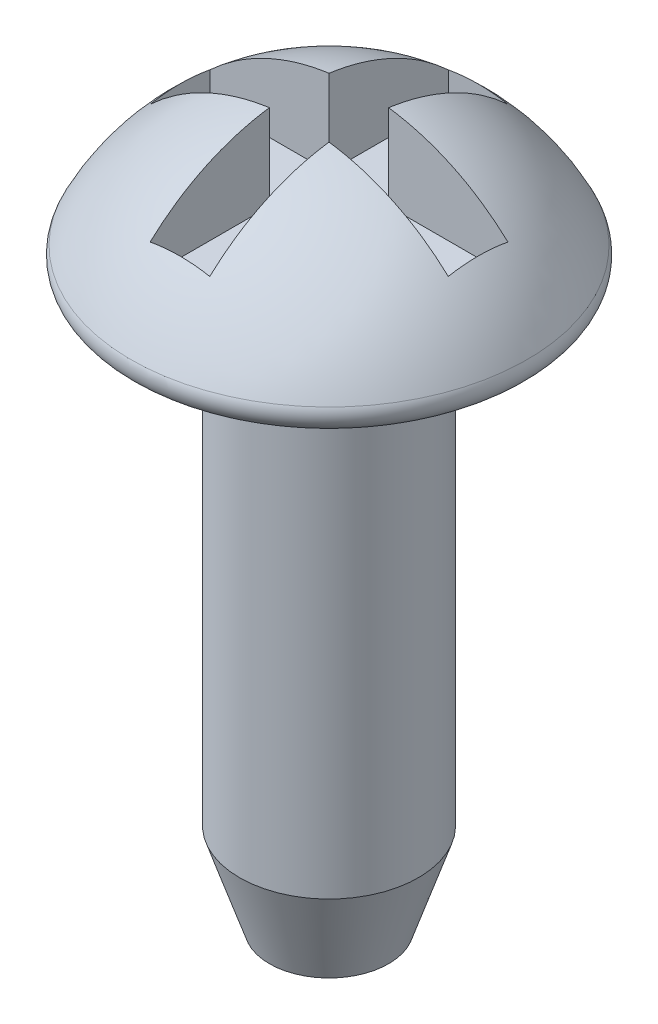
ISO-10303-21;
HEADER;
FILE_DESCRIPTION(('STEP AP214'),'2;1');
FILE_NAME('part.step','',(''),(''),'','','');
FILE_SCHEMA(('AUTOMOTIVE_DESIGN { 1 0 10303 214 1 1 1 1 }'));
ENDSEC;
DATA;
#1=APPLICATION_CONTEXT('core data for automotive mechanical design processes');
#2=APPLICATION_PROTOCOL_DEFINITION('international standard','automotive_design',2000,#1);
#3=PRODUCT_CONTEXT('',#1,'mechanical');
#4=PRODUCT('Part','Part','',(#3));
#5=PRODUCT_RELATED_PRODUCT_CATEGORY('part','',(#4));
#6=PRODUCT_DEFINITION_FORMATION('','',#4);
#7=PRODUCT_DEFINITION_CONTEXT('part definition',#1,'design');
#8=PRODUCT_DEFINITION('design','',#6,#7);
#9=PRODUCT_DEFINITION_SHAPE('','',#8);
#10=(LENGTH_UNIT() NAMED_UNIT(*) SI_UNIT(.MILLI.,.METRE.));
#11=(NAMED_UNIT(*) PLANE_ANGLE_UNIT() SI_UNIT($,.RADIAN.));
#12=(NAMED_UNIT(*) SI_UNIT($,.STERADIAN.) SOLID_ANGLE_UNIT());
#13=UNCERTAINTY_MEASURE_WITH_UNIT(LENGTH_MEASURE(1.E-05),#10,'distance_accuracy_value','');
#14=(GEOMETRIC_REPRESENTATION_CONTEXT(3) GLOBAL_UNCERTAINTY_ASSIGNED_CONTEXT((#13)) GLOBAL_UNIT_ASSIGNED_CONTEXT((#10,
#11,#12)) REPRESENTATION_CONTEXT('',''));
#15=CARTESIAN_POINT('',(0.,0.,0.));
#16=DIRECTION('',(0.,0.,1.));
#17=DIRECTION('',(1.,0.,0.));
#18=AXIS2_PLACEMENT_3D('',#15,#16,#17);
#19=CARTESIAN_POINT('',(0.,-1.2,0.));
#20=DIRECTION('',(0.,1.,0.));
#21=DIRECTION('',(1.,0.,0.));
#22=AXIS2_PLACEMENT_3D('',#19,#20,#21);
#23=SPHERICAL_SURFACE('',#22,3.7);
#24=CARTESIAN_POINT('',(0.,0.43235294117647,0.));
#25=DIRECTION('',(0.,-1.,0.));
#26=DIRECTION('',(0.,0.,-1.));
#27=AXIS2_PLACEMENT_3D('',#24,#25,#26);
#28=CIRCLE('',#27,3.32045537169716);
#29=CARTESIAN_POINT('',(0.,0.43235294117647,-3.32045537169716));
#30=VERTEX_POINT('',#29);
#31=EDGE_CURVE('E196',#30,#30,#28,.F.);
#32=ORIENTED_EDGE('',*,*,#31,.T.);
#33=EDGE_LOOP('',(#32));
#34=FACE_BOUND('',#33,.T.);
#35=CARTESIAN_POINT('',(0.,-1.2,-0.5));
#36=DIRECTION('',(0.,0.,1.));
#37=DIRECTION('',(1.,0.,0.));
#38=AXIS2_PLACEMENT_3D('',#35,#36,#37);
#39=CIRCLE('',#38,3.66606055596467);
#40=CARTESIAN_POINT('',(-2.5,1.48141753555838,-0.5));
#41=VERTEX_POINT('',#40);
#42=CARTESIAN_POINT('',(-0.5,2.43180395946698,-0.5));
#43=VERTEX_POINT('',#42);
#44=EDGE_CURVE('E40',#41,#43,#39,.F.);
#45=ORIENTED_EDGE('',*,*,#44,.T.);
#46=CARTESIAN_POINT('',(-0.5,-1.2,0.));
#47=DIRECTION('',(1.,0.,0.));
#48=DIRECTION('',(0.,0.,-1.));
#49=AXIS2_PLACEMENT_3D('',#46,#47,#48);
#50=CIRCLE('',#49,3.66606055596467);
#51=CARTESIAN_POINT('',(-0.5,1.48141753555838,-2.5));
#52=VERTEX_POINT('',#51);
#53=EDGE_CURVE('E11',#43,#52,#50,.F.);
#54=ORIENTED_EDGE('',*,*,#53,.T.);
#55=CARTESIAN_POINT('',(0.,-1.2,-2.5));
#56=DIRECTION('',(0.,0.,1.));
#57=DIRECTION('',(1.,0.,0.));
#58=AXIS2_PLACEMENT_3D('',#55,#56,#57);
#59=CIRCLE('',#58,2.72763633939717);
#60=CARTESIAN_POINT('',(0.5,1.48141753555838,-2.5));
#61=VERTEX_POINT('',#60);
#62=EDGE_CURVE('E202',#52,#61,#59,.F.);
#63=ORIENTED_EDGE('',*,*,#62,.T.);
#64=CARTESIAN_POINT('',(0.5,-1.2,0.));
#65=DIRECTION('',(-1.,0.,0.));
#66=DIRECTION('',(0.,0.,1.));
#67=AXIS2_PLACEMENT_3D('',#64,#65,#66);
#68=CIRCLE('',#67,3.66606055596467);
#69=CARTESIAN_POINT('',(0.5,2.43180395946698,-0.5));
#70=VERTEX_POINT('',#69);
#71=EDGE_CURVE('E205',#61,#70,#68,.F.);
#72=ORIENTED_EDGE('',*,*,#71,.T.);
#73=CARTESIAN_POINT('',(0.,-1.2,-0.5));
#74=DIRECTION('',(0.,0.,1.));
#75=DIRECTION('',(1.,0.,0.));
#76=AXIS2_PLACEMENT_3D('',#73,#74,#75);
#77=CIRCLE('',#76,3.66606055596467);
#78=CARTESIAN_POINT('',(2.5,1.48141753555839,-0.5));
#79=VERTEX_POINT('',#78);
#80=EDGE_CURVE('E208',#70,#79,#77,.F.);
#81=ORIENTED_EDGE('',*,*,#80,.T.);
#82=CARTESIAN_POINT('',(2.5,-1.2,0.));
#83=DIRECTION('',(-1.,0.,0.));
#84=DIRECTION('',(0.,0.,1.));
#85=AXIS2_PLACEMENT_3D('',#82,#83,#84);
#86=CIRCLE('',#85,2.72763633939717);
#87=CARTESIAN_POINT('',(2.5,1.48141753555838,0.5));
#88=VERTEX_POINT('',#87);
#89=EDGE_CURVE('E211',#79,#88,#86,.F.);
#90=ORIENTED_EDGE('',*,*,#89,.T.);
#91=CARTESIAN_POINT('',(0.,-1.2,0.5));
#92=DIRECTION('',(0.,0.,-1.));
#93=DIRECTION('',(-1.,0.,0.));
#94=AXIS2_PLACEMENT_3D('',#91,#92,#93);
#95=CIRCLE('',#94,3.66606055596467);
#96=CARTESIAN_POINT('',(0.5,2.43180395946698,0.5));
#97=VERTEX_POINT('',#96);
#98=EDGE_CURVE('E214',#88,#97,#95,.F.);
#99=ORIENTED_EDGE('',*,*,#98,.T.);
#100=CARTESIAN_POINT('',(0.5,-1.2,0.));
#101=DIRECTION('',(-1.,0.,0.));
#102=DIRECTION('',(0.,0.,1.));
#103=AXIS2_PLACEMENT_3D('',#100,#101,#102);
#104=CIRCLE('',#103,3.66606055596467);
#105=CARTESIAN_POINT('',(0.5,1.48141753555839,2.5));
#106=VERTEX_POINT('',#105);
#107=EDGE_CURVE('E217',#97,#106,#104,.F.);
#108=ORIENTED_EDGE('',*,*,#107,.T.);
#109=CARTESIAN_POINT('',(0.,-1.2,2.5));
#110=DIRECTION('',(0.,0.,-1.));
#111=DIRECTION('',(-1.,0.,0.));
#112=AXIS2_PLACEMENT_3D('',#109,#110,#111);
#113=CIRCLE('',#112,2.72763633939717);
#114=CARTESIAN_POINT('',(-0.5,1.48141753555838,2.5));
#115=VERTEX_POINT('',#114);
#116=EDGE_CURVE('E220',#106,#115,#113,.F.);
#117=ORIENTED_EDGE('',*,*,#116,.T.);
#118=CARTESIAN_POINT('',(-0.5,-1.2,0.));
#119=DIRECTION('',(1.,0.,0.));
#120=DIRECTION('',(0.,0.,-1.));
#121=AXIS2_PLACEMENT_3D('',#118,#119,#120);
#122=CIRCLE('',#121,3.66606055596467);
#123=CARTESIAN_POINT('',(-0.5,2.43180395946698,0.5));
#124=VERTEX_POINT('',#123);
#125=EDGE_CURVE('E223',#115,#124,#122,.F.);
#126=ORIENTED_EDGE('',*,*,#125,.T.);
#127=CARTESIAN_POINT('',(0.,-1.2,0.5));
#128=DIRECTION('',(0.,0.,-1.));
#129=DIRECTION('',(-1.,0.,0.));
#130=AXIS2_PLACEMENT_3D('',#127,#128,#129);
#131=CIRCLE('',#130,3.66606055596467);
#132=CARTESIAN_POINT('',(-2.5,1.48141753555838,0.5));
#133=VERTEX_POINT('',#132);
#134=EDGE_CURVE('E226',#124,#133,#131,.F.);
#135=ORIENTED_EDGE('',*,*,#134,.T.);
#136=CARTESIAN_POINT('',(-2.5,-1.2,0.));
#137=DIRECTION('',(1.,0.,0.));
#138=DIRECTION('',(0.,0.,-1.));
#139=AXIS2_PLACEMENT_3D('',#136,#137,#138);
#140=CIRCLE('',#139,2.72763633939717);
#141=EDGE_CURVE('E229',#133,#41,#140,.F.);
#142=ORIENTED_EDGE('',*,*,#141,.T.);
#143=EDGE_LOOP('',(#45,#54,#63,#72,#81,#90,#99,#108,#117,#126,#135,#142));
#144=FACE_BOUND('',#143,.T.);
#145=ADVANCED_FACE('F32',(#34,#144),#23,.T.);
#146=CARTESIAN_POINT('',(-1.5,0.,0.));
#147=DIRECTION('',(0.,-1.,0.));
#148=DIRECTION('',(0.,0.,-1.));
#149=AXIS2_PLACEMENT_3D('',#146,#147,#148);
#150=PLANE('',#149);
#151=CARTESIAN_POINT('',(0.,0.,0.));
#152=DIRECTION('',(0.,-1.,0.));
#153=DIRECTION('',(0.,0.,-1.));
#154=AXIS2_PLACEMENT_3D('',#151,#152,#153);
#155=CIRCLE('',#154,3.05122926047847);
#156=CARTESIAN_POINT('',(0.,0.,-3.05122926047847));
#157=VERTEX_POINT('',#156);
#158=EDGE_CURVE('E199',#157,#157,#155,.T.);
#159=ORIENTED_EDGE('',*,*,#158,.T.);
#160=EDGE_LOOP('',(#159));
#161=FACE_BOUND('',#160,.T.);
#162=CARTESIAN_POINT('',(0.,0.,0.));
#163=DIRECTION('',(0.,1.,0.));
#164=DIRECTION('',(0.,0.,1.));
#165=AXIS2_PLACEMENT_3D('',#162,#163,#164);
#166=CIRCLE('',#165,1.5);
#167=CARTESIAN_POINT('',(0.,0.,1.5));
#168=VERTEX_POINT('',#167);
#169=EDGE_CURVE('E125',#168,#168,#166,.T.);
#170=ORIENTED_EDGE('',*,*,#169,.T.);
#171=EDGE_LOOP('',(#170));
#172=FACE_BOUND('',#171,.T.);
#173=ADVANCED_FACE('F276',(#161,#172),#150,.T.);
#174=CARTESIAN_POINT('',(-1.,-9.5,0.));
#175=DIRECTION('',(0.,-1.,0.));
#176=DIRECTION('',(0.,0.,-1.));
#177=AXIS2_PLACEMENT_3D('',#174,#175,#176);
#178=PLANE('',#177);
#179=CARTESIAN_POINT('',(0.,-9.5,0.));
#180=DIRECTION('',(0.,1.,0.));
#181=DIRECTION('',(0.,0.,1.));
#182=AXIS2_PLACEMENT_3D('',#179,#180,#181);
#183=CIRCLE('',#182,1.);
#184=CARTESIAN_POINT('',(0.,-9.5,1.));
#185=VERTEX_POINT('',#184);
#186=EDGE_CURVE('E193',#185,#185,#183,.T.);
#187=ORIENTED_EDGE('',*,*,#186,.F.);
#188=EDGE_LOOP('',(#187));
#189=FACE_BOUND('',#188,.T.);
#190=ADVANCED_FACE('F282',(#189),#178,.T.);
#191=CARTESIAN_POINT('',(0.,-8.,0.));
#192=DIRECTION('',(0.,1.,0.));
#193=DIRECTION('',(0.,0.,1.));
#194=AXIS2_PLACEMENT_3D('',#191,#192,#193);
#195=CONICAL_SURFACE('',#194,1.5,0.321750554396641);
#196=ORIENTED_EDGE('',*,*,#186,.T.);
#197=EDGE_LOOP('',(#196));
#198=FACE_BOUND('',#197,.T.);
#199=CARTESIAN_POINT('',(0.,-8.,0.));
#200=DIRECTION('',(0.,1.,0.));
#201=DIRECTION('',(0.,0.,1.));
#202=AXIS2_PLACEMENT_3D('',#199,#200,#201);
#203=CIRCLE('',#202,1.5);
#204=CARTESIAN_POINT('',(0.,-8.,1.5));
#205=VERTEX_POINT('',#204);
#206=EDGE_CURVE('E190',#205,#205,#203,.T.);
#207=ORIENTED_EDGE('',*,*,#206,.F.);
#208=EDGE_LOOP('',(#207));
#209=FACE_BOUND('',#208,.T.);
#210=ADVANCED_FACE('F287',(#198,#209),#195,.T.);
#211=CARTESIAN_POINT('',(0.,-2.51401763173937,0.));
#212=DIRECTION('',(0.,1.,0.));
#213=DIRECTION('',(0.,0.,1.));
#214=AXIS2_PLACEMENT_3D('',#211,#212,#213);
#215=CYLINDRICAL_SURFACE('',#214,1.5);
#216=ORIENTED_EDGE('',*,*,#206,.T.);
#217=EDGE_LOOP('',(#216));
#218=FACE_BOUND('',#217,.T.);
#219=ORIENTED_EDGE('',*,*,#169,.F.);
#220=EDGE_LOOP('',(#219));
#221=FACE_BOUND('',#220,.T.);
#222=ADVANCED_FACE('F291',(#218,#221),#215,.T.);
#223=CARTESIAN_POINT('',(0.,0.3,0.));
#224=DIRECTION('',(0.,-1.,0.));
#225=DIRECTION('',(0.,0.,-1.));
#226=AXIS2_PLACEMENT_3D('',#223,#224,#225);
#227=TOROIDAL_SURFACE('',#226,3.05122926047847,0.3);
#228=ORIENTED_EDGE('',*,*,#158,.F.);
#229=EDGE_LOOP('',(#228));
#230=FACE_BOUND('',#229,.T.);
#231=ORIENTED_EDGE('',*,*,#31,.F.);
#232=EDGE_LOOP('',(#231));
#233=FACE_BOUND('',#232,.T.);
#234=ADVANCED_FACE('F34',(#230,#233),#227,.T.);
#235=CARTESIAN_POINT('',(-0.5,2.5,-2.5));
#236=DIRECTION('',(1.,0.,0.));
#237=DIRECTION('',(0.,0.,-1.));
#238=AXIS2_PLACEMENT_3D('',#235,#236,#237);
#239=PLANE('',#238);
#240=DIRECTION('',(0.,-1.,0.));
#241=VECTOR('',#240,1.);
#242=CARTESIAN_POINT('',(-0.5,2.5,-0.5));
#243=LINE('',#242,#241);
#244=CARTESIAN_POINT('',(-0.5,1.,-0.5));
#245=VERTEX_POINT('',#244);
#246=EDGE_CURVE('E118',#43,#245,#243,.T.);
#247=ORIENTED_EDGE('',*,*,#246,.T.);
#248=DIRECTION('',(0.,0.,1.));
#249=VECTOR('',#248,1.);
#250=CARTESIAN_POINT('',(-0.5,1.,-2.5));
#251=LINE('',#250,#249);
#252=CARTESIAN_POINT('',(-0.5,1.,-2.5));
#253=VERTEX_POINT('',#252);
#254=EDGE_CURVE('E122',#253,#245,#251,.T.);
#255=ORIENTED_EDGE('',*,*,#254,.F.);
#256=DIRECTION('',(0.,-1.,0.));
#257=VECTOR('',#256,1.);
#258=CARTESIAN_POINT('',(-0.5,2.5,-2.5));
#259=LINE('',#258,#257);
#260=EDGE_CURVE('E168',#52,#253,#259,.T.);
#261=ORIENTED_EDGE('',*,*,#260,.F.);
#262=ORIENTED_EDGE('',*,*,#53,.F.);
#263=EDGE_LOOP('',(#247,#255,#261,#262));
#264=FACE_BOUND('',#263,.T.);
#265=ADVANCED_FACE('F120',(#264),#239,.T.);
#266=CARTESIAN_POINT('',(-2.5,2.5,-0.5));
#267=DIRECTION('',(0.,0.,1.));
#268=DIRECTION('',(1.,0.,0.));
#269=AXIS2_PLACEMENT_3D('',#266,#267,#268);
#270=PLANE('',#269);
#271=DIRECTION('',(0.,-1.,0.));
#272=VECTOR('',#271,1.);
#273=CARTESIAN_POINT('',(-2.5,2.5,-0.5));
#274=LINE('',#273,#272);
#275=CARTESIAN_POINT('',(-2.5,1.,-0.5));
#276=VERTEX_POINT('',#275);
#277=EDGE_CURVE('E126',#41,#276,#274,.T.);
#278=ORIENTED_EDGE('',*,*,#277,.T.);
#279=DIRECTION('',(-1.,0.,0.));
#280=VECTOR('',#279,1.);
#281=CARTESIAN_POINT('',(-2.5,1.,-0.5));
#282=LINE('',#281,#280);
#283=EDGE_CURVE('E129',#245,#276,#282,.T.);
#284=ORIENTED_EDGE('',*,*,#283,.F.);
#285=ORIENTED_EDGE('',*,*,#246,.F.);
#286=ORIENTED_EDGE('',*,*,#44,.F.);
#287=EDGE_LOOP('',(#278,#284,#285,#286));
#288=FACE_BOUND('',#287,.T.);
#289=ADVANCED_FACE('F130',(#288),#270,.T.);
#290=CARTESIAN_POINT('',(-2.5,2.5,-0.5));
#291=DIRECTION('',(1.,0.,0.));
#292=DIRECTION('',(0.,0.,-1.));
#293=AXIS2_PLACEMENT_3D('',#290,#291,#292);
#294=PLANE('',#293);
#295=DIRECTION('',(0.,-1.,0.));
#296=VECTOR('',#295,1.);
#297=CARTESIAN_POINT('',(-2.5,2.5,0.5));
#298=LINE('',#297,#296);
#299=CARTESIAN_POINT('',(-2.5,1.,0.5));
#300=VERTEX_POINT('',#299);
#301=EDGE_CURVE('E185',#133,#300,#298,.T.);
#302=ORIENTED_EDGE('',*,*,#301,.T.);
#303=DIRECTION('',(0.,0.,1.));
#304=VECTOR('',#303,1.);
#305=CARTESIAN_POINT('',(-2.5,1.,-0.5));
#306=LINE('',#305,#304);
#307=EDGE_CURVE('E135',#276,#300,#306,.T.);
#308=ORIENTED_EDGE('',*,*,#307,.F.);
#309=ORIENTED_EDGE('',*,*,#277,.F.);
#310=ORIENTED_EDGE('',*,*,#141,.F.);
#311=EDGE_LOOP('',(#302,#308,#309,#310));
#312=FACE_BOUND('',#311,.T.);
#313=ADVANCED_FACE('F233',(#312),#294,.T.);
#314=CARTESIAN_POINT('',(-2.5,2.5,0.5));
#315=DIRECTION('',(0.,0.,-1.));
#316=DIRECTION('',(-1.,0.,0.));
#317=AXIS2_PLACEMENT_3D('',#314,#315,#316);
#318=PLANE('',#317);
#319=DIRECTION('',(0.,-1.,0.));
#320=VECTOR('',#319,1.);
#321=CARTESIAN_POINT('',(-0.5,2.5,0.5));
#322=LINE('',#321,#320);
#323=CARTESIAN_POINT('',(-0.5,1.,0.5));
#324=VERTEX_POINT('',#323);
#325=EDGE_CURVE('E183',#124,#324,#322,.T.);
#326=ORIENTED_EDGE('',*,*,#325,.T.);
#327=DIRECTION('',(1.,0.,0.));
#328=VECTOR('',#327,1.);
#329=CARTESIAN_POINT('',(-2.5,1.,0.5));
#330=LINE('',#329,#328);
#331=EDGE_CURVE('E144',#300,#324,#330,.T.);
#332=ORIENTED_EDGE('',*,*,#331,.F.);
#333=ORIENTED_EDGE('',*,*,#301,.F.);
#334=ORIENTED_EDGE('',*,*,#134,.F.);
#335=EDGE_LOOP('',(#326,#332,#333,#334));
#336=FACE_BOUND('',#335,.T.);
#337=ADVANCED_FACE('F238',(#336),#318,.T.);
#338=CARTESIAN_POINT('',(-0.5,2.5,0.5));
#339=DIRECTION('',(1.,0.,0.));
#340=DIRECTION('',(0.,0.,-1.));
#341=AXIS2_PLACEMENT_3D('',#338,#339,#340);
#342=PLANE('',#341);
#343=DIRECTION('',(0.,-1.,0.));
#344=VECTOR('',#343,1.);
#345=CARTESIAN_POINT('',(-0.5,2.5,2.5));
#346=LINE('',#345,#344);
#347=CARTESIAN_POINT('',(-0.5,1.,2.5));
#348=VERTEX_POINT('',#347);
#349=EDGE_CURVE('E181',#115,#348,#346,.T.);
#350=ORIENTED_EDGE('',*,*,#349,.T.);
#351=DIRECTION('',(0.,0.,1.));
#352=VECTOR('',#351,1.);
#353=CARTESIAN_POINT('',(-0.5,1.,0.5));
#354=LINE('',#353,#352);
#355=EDGE_CURVE('E147',#324,#348,#354,.T.);
#356=ORIENTED_EDGE('',*,*,#355,.F.);
#357=ORIENTED_EDGE('',*,*,#325,.F.);
#358=ORIENTED_EDGE('',*,*,#125,.F.);
#359=EDGE_LOOP('',(#350,#356,#357,#358));
#360=FACE_BOUND('',#359,.T.);
#361=ADVANCED_FACE('F241',(#360),#342,.T.);
#362=CARTESIAN_POINT('',(-0.5,2.5,2.5));
#363=DIRECTION('',(0.,0.,-1.));
#364=DIRECTION('',(-1.,0.,0.));
#365=AXIS2_PLACEMENT_3D('',#362,#363,#364);
#366=PLANE('',#365);
#367=DIRECTION('',(0.,-1.,0.));
#368=VECTOR('',#367,1.);
#369=CARTESIAN_POINT('',(0.5,2.5,2.5));
#370=LINE('',#369,#368);
#371=CARTESIAN_POINT('',(0.5,1.,2.5));
#372=VERTEX_POINT('',#371);
#373=EDGE_CURVE('E179',#106,#372,#370,.T.);
#374=ORIENTED_EDGE('',*,*,#373,.T.);
#375=DIRECTION('',(1.,0.,0.));
#376=VECTOR('',#375,1.);
#377=CARTESIAN_POINT('',(-0.5,1.,2.5));
#378=LINE('',#377,#376);
#379=EDGE_CURVE('E150',#348,#372,#378,.T.);
#380=ORIENTED_EDGE('',*,*,#379,.F.);
#381=ORIENTED_EDGE('',*,*,#349,.F.);
#382=ORIENTED_EDGE('',*,*,#116,.F.);
#383=EDGE_LOOP('',(#374,#380,#381,#382));
#384=FACE_BOUND('',#383,.T.);
#385=ADVANCED_FACE('F245',(#384),#366,.T.);
#386=CARTESIAN_POINT('',(0.5,2.5,0.5));
#387=DIRECTION('',(-1.,0.,0.));
#388=DIRECTION('',(0.,0.,1.));
#389=AXIS2_PLACEMENT_3D('',#386,#387,#388);
#390=PLANE('',#389);
#391=DIRECTION('',(0.,-1.,0.));
#392=VECTOR('',#391,1.);
#393=CARTESIAN_POINT('',(0.5,2.5,0.5));
#394=LINE('',#393,#392);
#395=CARTESIAN_POINT('',(0.5,1.,0.5));
#396=VERTEX_POINT('',#395);
#397=EDGE_CURVE('E177',#97,#396,#394,.T.);
#398=ORIENTED_EDGE('',*,*,#397,.T.);
#399=DIRECTION('',(0.,0.,-1.));
#400=VECTOR('',#399,1.);
#401=CARTESIAN_POINT('',(0.5,1.,0.5));
#402=LINE('',#401,#400);
#403=EDGE_CURVE('E153',#372,#396,#402,.T.);
#404=ORIENTED_EDGE('',*,*,#403,.F.);
#405=ORIENTED_EDGE('',*,*,#373,.F.);
#406=ORIENTED_EDGE('',*,*,#107,.F.);
#407=EDGE_LOOP('',(#398,#404,#405,#406));
#408=FACE_BOUND('',#407,.T.);
#409=ADVANCED_FACE('F249',(#408),#390,.T.);
#410=CARTESIAN_POINT('',(0.5,2.5,0.5));
#411=DIRECTION('',(0.,0.,-1.));
#412=DIRECTION('',(-1.,0.,0.));
#413=AXIS2_PLACEMENT_3D('',#410,#411,#412);
#414=PLANE('',#413);
#415=DIRECTION('',(0.,-1.,0.));
#416=VECTOR('',#415,1.);
#417=CARTESIAN_POINT('',(2.5,2.5,0.5));
#418=LINE('',#417,#416);
#419=CARTESIAN_POINT('',(2.5,1.,0.5));
#420=VERTEX_POINT('',#419);
#421=EDGE_CURVE('E175',#88,#420,#418,.T.);
#422=ORIENTED_EDGE('',*,*,#421,.T.);
#423=DIRECTION('',(1.,0.,0.));
#424=VECTOR('',#423,1.);
#425=CARTESIAN_POINT('',(0.5,1.,0.5));
#426=LINE('',#425,#424);
#427=EDGE_CURVE('E156',#396,#420,#426,.T.);
#428=ORIENTED_EDGE('',*,*,#427,.F.);
#429=ORIENTED_EDGE('',*,*,#397,.F.);
#430=ORIENTED_EDGE('',*,*,#98,.F.);
#431=EDGE_LOOP('',(#422,#428,#429,#430));
#432=FACE_BOUND('',#431,.T.);
#433=ADVANCED_FACE('F254',(#432),#414,.T.);
#434=CARTESIAN_POINT('',(2.5,2.5,-0.5));
#435=DIRECTION('',(-1.,0.,0.));
#436=DIRECTION('',(0.,0.,1.));
#437=AXIS2_PLACEMENT_3D('',#434,#435,#436);
#438=PLANE('',#437);
#439=DIRECTION('',(0.,-1.,0.));
#440=VECTOR('',#439,1.);
#441=CARTESIAN_POINT('',(2.5,2.5,-0.5));
#442=LINE('',#441,#440);
#443=CARTESIAN_POINT('',(2.5,1.,-0.5));
#444=VERTEX_POINT('',#443);
#445=EDGE_CURVE('E173',#79,#444,#442,.T.);
#446=ORIENTED_EDGE('',*,*,#445,.T.);
#447=DIRECTION('',(0.,0.,-1.));
#448=VECTOR('',#447,1.);
#449=CARTESIAN_POINT('',(2.5,1.,-0.5));
#450=LINE('',#449,#448);
#451=EDGE_CURVE('E159',#420,#444,#450,.T.);
#452=ORIENTED_EDGE('',*,*,#451,.F.);
#453=ORIENTED_EDGE('',*,*,#421,.F.);
#454=ORIENTED_EDGE('',*,*,#89,.F.);
#455=EDGE_LOOP('',(#446,#452,#453,#454));
#456=FACE_BOUND('',#455,.T.);
#457=ADVANCED_FACE('F257',(#456),#438,.T.);
#458=CARTESIAN_POINT('',(0.5,2.5,-0.5));
#459=DIRECTION('',(0.,0.,1.));
#460=DIRECTION('',(1.,0.,0.));
#461=AXIS2_PLACEMENT_3D('',#458,#459,#460);
#462=PLANE('',#461);
#463=DIRECTION('',(0.,-1.,0.));
#464=VECTOR('',#463,1.);
#465=CARTESIAN_POINT('',(0.5,2.5,-0.5));
#466=LINE('',#465,#464);
#467=CARTESIAN_POINT('',(0.5,1.,-0.5));
#468=VERTEX_POINT('',#467);
#469=EDGE_CURVE('E171',#70,#468,#466,.T.);
#470=ORIENTED_EDGE('',*,*,#469,.T.);
#471=DIRECTION('',(-1.,0.,0.));
#472=VECTOR('',#471,1.);
#473=CARTESIAN_POINT('',(0.5,1.,-0.5));
#474=LINE('',#473,#472);
#475=EDGE_CURVE('E162',#444,#468,#474,.T.);
#476=ORIENTED_EDGE('',*,*,#475,.F.);
#477=ORIENTED_EDGE('',*,*,#445,.F.);
#478=ORIENTED_EDGE('',*,*,#80,.F.);
#479=EDGE_LOOP('',(#470,#476,#477,#478));
#480=FACE_BOUND('',#479,.T.);
#481=ADVANCED_FACE('F261',(#480),#462,.T.);
#482=CARTESIAN_POINT('',(0.5,2.5,-2.5));
#483=DIRECTION('',(-1.,0.,0.));
#484=DIRECTION('',(0.,0.,1.));
#485=AXIS2_PLACEMENT_3D('',#482,#483,#484);
#486=PLANE('',#485);
#487=DIRECTION('',(0.,-1.,0.));
#488=VECTOR('',#487,1.);
#489=CARTESIAN_POINT('',(0.5,2.5,-2.5));
#490=LINE('',#489,#488);
#491=CARTESIAN_POINT('',(0.5,1.,-2.5));
#492=VERTEX_POINT('',#491);
#493=EDGE_CURVE('E47',#61,#492,#490,.T.);
#494=ORIENTED_EDGE('',*,*,#493,.T.);
#495=DIRECTION('',(0.,0.,-1.));
#496=VECTOR('',#495,1.);
#497=CARTESIAN_POINT('',(0.5,1.,-2.5));
#498=LINE('',#497,#496);
#499=EDGE_CURVE('E165',#468,#492,#498,.T.);
#500=ORIENTED_EDGE('',*,*,#499,.F.);
#501=ORIENTED_EDGE('',*,*,#469,.F.);
#502=ORIENTED_EDGE('',*,*,#71,.F.);
#503=EDGE_LOOP('',(#494,#500,#501,#502));
#504=FACE_BOUND('',#503,.T.);
#505=ADVANCED_FACE('F265',(#504),#486,.T.);
#506=CARTESIAN_POINT('',(-0.5,2.5,-2.5));
#507=DIRECTION('',(0.,0.,1.));
#508=DIRECTION('',(1.,0.,0.));
#509=AXIS2_PLACEMENT_3D('',#506,#507,#508);
#510=PLANE('',#509);
#511=ORIENTED_EDGE('',*,*,#260,.T.);
#512=DIRECTION('',(-1.,0.,0.));
#513=VECTOR('',#512,1.);
#514=CARTESIAN_POINT('',(-0.5,1.,-2.5));
#515=LINE('',#514,#513);
#516=EDGE_CURVE('E140',#492,#253,#515,.T.);
#517=ORIENTED_EDGE('',*,*,#516,.F.);
#518=ORIENTED_EDGE('',*,*,#493,.F.);
#519=ORIENTED_EDGE('',*,*,#62,.F.);
#520=EDGE_LOOP('',(#511,#517,#518,#519));
#521=FACE_BOUND('',#520,.T.);
#522=ADVANCED_FACE('F266',(#521),#510,.T.);
#523=CARTESIAN_POINT('',(0.,1.,0.));
#524=DIRECTION('',(0.,1.,0.));
#525=DIRECTION('',(0.,0.,1.));
#526=AXIS2_PLACEMENT_3D('',#523,#524,#525);
#527=PLANE('',#526);
#528=ORIENTED_EDGE('',*,*,#254,.T.);
#529=ORIENTED_EDGE('',*,*,#283,.T.);
#530=ORIENTED_EDGE('',*,*,#307,.T.);
#531=ORIENTED_EDGE('',*,*,#331,.T.);
#532=ORIENTED_EDGE('',*,*,#355,.T.);
#533=ORIENTED_EDGE('',*,*,#379,.T.);
#534=ORIENTED_EDGE('',*,*,#403,.T.);
#535=ORIENTED_EDGE('',*,*,#427,.T.);
#536=ORIENTED_EDGE('',*,*,#451,.T.);
#537=ORIENTED_EDGE('',*,*,#475,.T.);
#538=ORIENTED_EDGE('',*,*,#499,.T.);
#539=ORIENTED_EDGE('',*,*,#516,.T.);
#540=EDGE_LOOP('',(#528,#529,#530,#531,#532,#533,#534,#535,#536,#537,#538,#539));
#541=FACE_BOUND('',#540,.T.);
#542=ADVANCED_FACE('F138',(#541),#527,.T.);
#543=CLOSED_SHELL('',(#145,#173,#190,#210,#222,#234,#265,#289,#313,#337,#361,#385,#409,#433,
#457,#481,#505,#522,#542));
#544=MANIFOLD_SOLID_BREP('B2',#543);
#545=ADVANCED_BREP_SHAPE_REPRESENTATION('',(#18,#544),#14);
#546=SHAPE_DEFINITION_REPRESENTATION(#9,#545);
ENDSEC;
END-ISO-10303-21;
